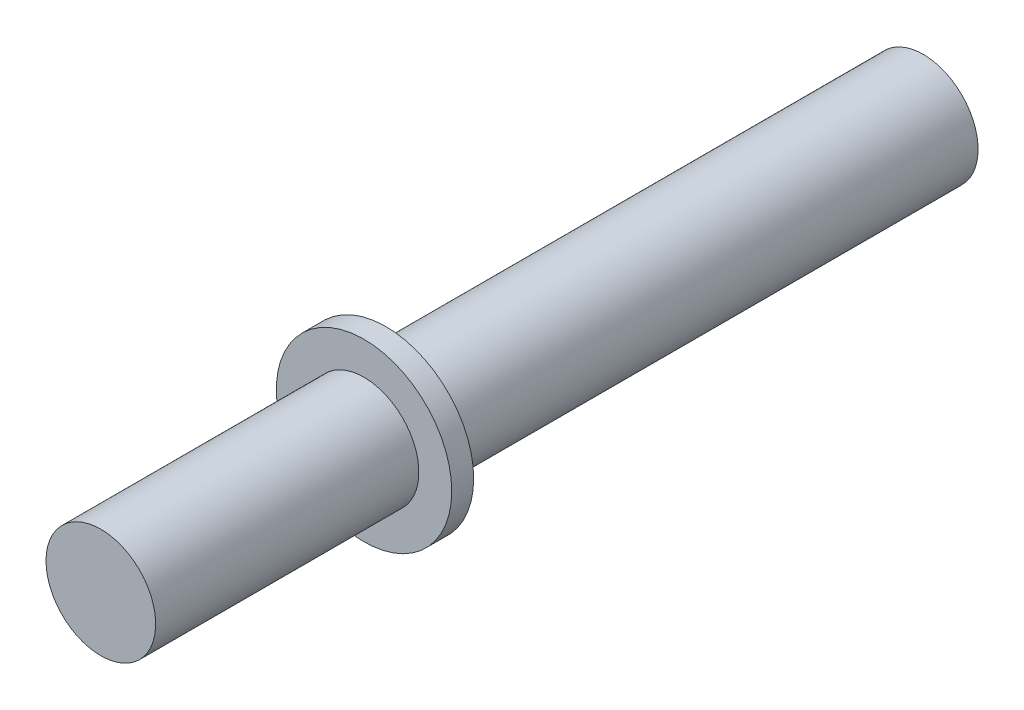
ISO-10303-21;
HEADER;
FILE_DESCRIPTION(('STEP AP214'),'2;1');
FILE_NAME('part.step','',(''),(''),'','','');
FILE_SCHEMA(('AUTOMOTIVE_DESIGN { 1 0 10303 214 1 1 1 1 }'));
ENDSEC;
DATA;
#1=APPLICATION_CONTEXT('core data for automotive mechanical design processes');
#2=APPLICATION_PROTOCOL_DEFINITION('international standard','automotive_design',2000,#1);
#3=PRODUCT_CONTEXT('',#1,'mechanical');
#4=PRODUCT('Part','Part','',(#3));
#5=PRODUCT_RELATED_PRODUCT_CATEGORY('part','',(#4));
#6=PRODUCT_DEFINITION_FORMATION('','',#4);
#7=PRODUCT_DEFINITION_CONTEXT('part definition',#1,'design');
#8=PRODUCT_DEFINITION('design','',#6,#7);
#9=PRODUCT_DEFINITION_SHAPE('','',#8);
#10=(LENGTH_UNIT() NAMED_UNIT(*) SI_UNIT(.MILLI.,.METRE.));
#11=(NAMED_UNIT(*) PLANE_ANGLE_UNIT() SI_UNIT($,.RADIAN.));
#12=(NAMED_UNIT(*) SI_UNIT($,.STERADIAN.) SOLID_ANGLE_UNIT());
#13=UNCERTAINTY_MEASURE_WITH_UNIT(LENGTH_MEASURE(1.E-05),#10,'distance_accuracy_value','');
#14=(GEOMETRIC_REPRESENTATION_CONTEXT(3) GLOBAL_UNCERTAINTY_ASSIGNED_CONTEXT((#13)) GLOBAL_UNIT_ASSIGNED_CONTEXT((#10,
#11,#12)) REPRESENTATION_CONTEXT('',''));
#15=CARTESIAN_POINT('',(0.,0.,0.));
#16=DIRECTION('',(0.,0.,1.));
#17=DIRECTION('',(1.,0.,0.));
#18=AXIS2_PLACEMENT_3D('',#15,#16,#17);
#19=CARTESIAN_POINT('',(-32.018684277368,-41.7454165571395,44.));
#20=DIRECTION('',(0.,0.,-1.));
#21=DIRECTION('',(-1.,0.,0.));
#22=AXIS2_PLACEMENT_3D('',#19,#20,#21);
#23=CYLINDRICAL_SURFACE('',#22,1.5);
#24=CARTESIAN_POINT('',(-32.018684277368,-41.7454165571395,36.8));
#25=DIRECTION('',(0.,0.,1.));
#26=DIRECTION('',(1.,0.,0.));
#27=AXIS2_PLACEMENT_3D('',#24,#25,#26);
#28=CIRCLE('',#27,1.5);
#29=CARTESIAN_POINT('',(-33.518684277368,-41.7454165571395,36.8));
#30=VERTEX_POINT('',#29);
#31=EDGE_CURVE('E41',#30,#30,#28,.T.);
#32=CARTESIAN_POINT('',(-32.018684277368,-41.7454165571395,44.));
#33=DIRECTION('',(0.,0.,1.));
#34=DIRECTION('',(1.,0.,0.));
#35=AXIS2_PLACEMENT_3D('',#32,#33,#34);
#36=CIRCLE('',#35,1.5);
#37=CARTESIAN_POINT('',(-33.518684277368,-41.7454165571395,44.));
#38=VERTEX_POINT('',#37);
#39=EDGE_CURVE('E45',#38,#38,#36,.T.);
#40=CARTESIAN_POINT('',(-33.518684277368,-41.7454165571395,36.8));
#41=CARTESIAN_POINT('',(-33.518684277368,-41.7454165571395,36.875));
#42=CARTESIAN_POINT('',(-33.518684277368,-41.7454165571395,36.95));
#43=CARTESIAN_POINT('',(-33.518684277368,-41.7454165571395,37.1));
#44=CARTESIAN_POINT('',(-33.518684277368,-41.7454165571395,37.175));
#45=CARTESIAN_POINT('',(-33.518684277368,-41.7454165571395,37.325));
#46=CARTESIAN_POINT('',(-33.518684277368,-41.7454165571395,37.4));
#47=CARTESIAN_POINT('',(-33.518684277368,-41.7454165571395,37.55));
#48=CARTESIAN_POINT('',(-33.518684277368,-41.7454165571395,37.625));
#49=CARTESIAN_POINT('',(-33.518684277368,-41.7454165571395,37.775));
#50=CARTESIAN_POINT('',(-33.518684277368,-41.7454165571395,37.85));
#51=CARTESIAN_POINT('',(-33.518684277368,-41.7454165571395,38.));
#52=CARTESIAN_POINT('',(-33.518684277368,-41.7454165571395,38.075));
#53=CARTESIAN_POINT('',(-33.518684277368,-41.7454165571395,38.225));
#54=CARTESIAN_POINT('',(-33.518684277368,-41.7454165571395,38.3));
#55=CARTESIAN_POINT('',(-33.518684277368,-41.7454165571395,38.45));
#56=CARTESIAN_POINT('',(-33.518684277368,-41.7454165571395,38.525));
#57=CARTESIAN_POINT('',(-33.518684277368,-41.7454165571395,38.675));
#58=CARTESIAN_POINT('',(-33.518684277368,-41.7454165571395,38.75));
#59=CARTESIAN_POINT('',(-33.518684277368,-41.7454165571395,38.9));
#60=CARTESIAN_POINT('',(-33.518684277368,-41.7454165571395,38.975));
#61=CARTESIAN_POINT('',(-33.518684277368,-41.7454165571395,39.125));
#62=CARTESIAN_POINT('',(-33.518684277368,-41.7454165571395,39.2));
#63=CARTESIAN_POINT('',(-33.518684277368,-41.7454165571395,39.35));
#64=CARTESIAN_POINT('',(-33.518684277368,-41.7454165571395,39.425));
#65=CARTESIAN_POINT('',(-33.518684277368,-41.7454165571395,39.575));
#66=CARTESIAN_POINT('',(-33.518684277368,-41.7454165571395,39.65));
#67=CARTESIAN_POINT('',(-33.518684277368,-41.7454165571395,39.8));
#68=CARTESIAN_POINT('',(-33.518684277368,-41.7454165571395,39.875));
#69=CARTESIAN_POINT('',(-33.518684277368,-41.7454165571395,40.025));
#70=CARTESIAN_POINT('',(-33.518684277368,-41.7454165571395,40.1));
#71=CARTESIAN_POINT('',(-33.518684277368,-41.7454165571395,40.25));
#72=CARTESIAN_POINT('',(-33.518684277368,-41.7454165571395,40.325));
#73=CARTESIAN_POINT('',(-33.518684277368,-41.7454165571395,40.475));
#74=CARTESIAN_POINT('',(-33.518684277368,-41.7454165571395,40.55));
#75=CARTESIAN_POINT('',(-33.518684277368,-41.7454165571395,40.7));
#76=CARTESIAN_POINT('',(-33.518684277368,-41.7454165571395,40.775));
#77=CARTESIAN_POINT('',(-33.518684277368,-41.7454165571395,40.925));
#78=CARTESIAN_POINT('',(-33.518684277368,-41.7454165571395,41.));
#79=CARTESIAN_POINT('',(-33.518684277368,-41.7454165571395,41.15));
#80=CARTESIAN_POINT('',(-33.518684277368,-41.7454165571395,41.225));
#81=CARTESIAN_POINT('',(-33.518684277368,-41.7454165571395,41.375));
#82=CARTESIAN_POINT('',(-33.518684277368,-41.7454165571395,41.45));
#83=CARTESIAN_POINT('',(-33.518684277368,-41.7454165571395,41.6));
#84=CARTESIAN_POINT('',(-33.518684277368,-41.7454165571395,41.675));
#85=CARTESIAN_POINT('',(-33.518684277368,-41.7454165571395,41.825));
#86=CARTESIAN_POINT('',(-33.518684277368,-41.7454165571395,41.9));
#87=CARTESIAN_POINT('',(-33.518684277368,-41.7454165571395,42.05));
#88=CARTESIAN_POINT('',(-33.518684277368,-41.7454165571395,42.125));
#89=CARTESIAN_POINT('',(-33.518684277368,-41.7454165571395,42.275));
#90=CARTESIAN_POINT('',(-33.518684277368,-41.7454165571395,42.35));
#91=CARTESIAN_POINT('',(-33.518684277368,-41.7454165571395,42.5));
#92=CARTESIAN_POINT('',(-33.518684277368,-41.7454165571395,42.575));
#93=CARTESIAN_POINT('',(-33.518684277368,-41.7454165571395,42.725));
#94=CARTESIAN_POINT('',(-33.518684277368,-41.7454165571395,42.8));
#95=CARTESIAN_POINT('',(-33.518684277368,-41.7454165571395,42.95));
#96=CARTESIAN_POINT('',(-33.518684277368,-41.7454165571395,43.025));
#97=CARTESIAN_POINT('',(-33.518684277368,-41.7454165571395,43.175));
#98=CARTESIAN_POINT('',(-33.518684277368,-41.7454165571395,43.25));
#99=CARTESIAN_POINT('',(-33.518684277368,-41.7454165571395,43.4));
#100=CARTESIAN_POINT('',(-33.518684277368,-41.7454165571395,43.475));
#101=CARTESIAN_POINT('',(-33.518684277368,-41.7454165571395,43.625));
#102=CARTESIAN_POINT('',(-33.518684277368,-41.7454165571395,43.7));
#103=CARTESIAN_POINT('',(-33.518684277368,-41.7454165571395,43.85));
#104=CARTESIAN_POINT('',(-33.518684277368,-41.7454165571395,43.925));
#105=CARTESIAN_POINT('',(-33.518684277368,-41.7454165571395,44.));
#106=B_SPLINE_CURVE_WITH_KNOTS('',3,(#40,#41,#42,#43,#44,#45,#46,#47,#48,#49,#50,#51,#52,#53,
#54,#55,#56,#57,#58,#59,#60,#61,#62,#63,#64,#65,#66,#67,#68,#69,#70,#71,#72,#73,#74,#75,#76,#77,
#78,#79,#80,#81,#82,#83,#84,#85,#86,#87,#88,#89,#90,#91,#92,#93,#94,#95,#96,#97,#98,#99,#100,
#101,#102,#103,#104,#105),.UNSPECIFIED.,.F.,.F.,(4,2,2,2,2,2,2,2,2,2,2,2,2,2,2,2,2,2,2,2,2,2,2,
2,2,2,2,2,2,2,2,2,4),(0.,0.224999999999996,0.449999999999999,0.674999999999995,
0.899999999999998,1.12499999999999,1.35,1.57499999999999,1.8,2.02499999999999,2.25,2.475,
2.69999999999999,2.92499999999999,3.14999999999999,3.375,3.59999999999999,3.82499999999999,
4.04999999999999,4.27499999999999,4.49999999999999,4.72499999999999,4.94999999999999,
5.17499999999999,5.39999999999999,5.62499999999999,5.84999999999999,6.07499999999999,
6.29999999999999,6.52499999999999,6.74999999999999,6.97499999999999,7.19999999999999),.UNSPECIFIED.);
#107=EDGE_CURVE('BSEAM38',#30,#38,#106,.T.);
#108=ORIENTED_EDGE('',*,*,#31,.T.);
#109=ORIENTED_EDGE('',*,*,#39,.F.);
#110=ORIENTED_EDGE('',*,*,#107,.T.);
#111=ORIENTED_EDGE('',*,*,#107,.F.);
#112=EDGE_LOOP('',(#108,#110,#109,#111));
#113=FACE_BOUND('',#112,.T.);
#114=ADVANCED_FACE('F38',(#113),#23,.T.);
#115=CARTESIAN_POINT('',(-32.018684277368,-41.7454165571395,44.));
#116=DIRECTION('',(0.,0.,1.));
#117=DIRECTION('',(1.,0.,0.));
#118=AXIS2_PLACEMENT_3D('',#115,#116,#117);
#119=PLANE('',#118);
#120=ORIENTED_EDGE('',*,*,#39,.T.);
#121=EDGE_LOOP('',(#120));
#122=FACE_BOUND('',#121,.T.);
#123=ADVANCED_FACE('F77',(#122),#119,.T.);
#124=CARTESIAN_POINT('',(-32.018684277368,-41.7454165571395,36.8));
#125=DIRECTION('',(0.,0.,-1.));
#126=DIRECTION('',(-1.,0.,0.));
#127=AXIS2_PLACEMENT_3D('',#124,#125,#126);
#128=CYLINDRICAL_SURFACE('',#127,2.4);
#129=CARTESIAN_POINT('',(-32.018684277368,-41.7454165571395,36.8));
#130=DIRECTION('',(0.,0.,1.));
#131=DIRECTION('',(1.,0.,0.));
#132=AXIS2_PLACEMENT_3D('',#129,#130,#131);
#133=CIRCLE('',#132,2.4);
#134=CARTESIAN_POINT('',(-29.618684277368,-41.7454165571395,36.8));
#135=VERTEX_POINT('',#134);
#136=EDGE_CURVE('E57',#135,#135,#133,.T.);
#137=ORIENTED_EDGE('',*,*,#136,.F.);
#138=EDGE_LOOP('',(#137));
#139=FACE_BOUND('',#138,.T.);
#140=CARTESIAN_POINT('',(-32.018684277368,-41.7454165571395,36.2));
#141=DIRECTION('',(0.,0.,1.));
#142=DIRECTION('',(1.,0.,0.));
#143=AXIS2_PLACEMENT_3D('',#140,#141,#142);
#144=CIRCLE('',#143,2.4);
#145=CARTESIAN_POINT('',(-29.618684277368,-41.7454165571395,36.2));
#146=VERTEX_POINT('',#145);
#147=EDGE_CURVE('E54',#146,#146,#144,.T.);
#148=ORIENTED_EDGE('',*,*,#147,.T.);
#149=EDGE_LOOP('',(#148));
#150=FACE_BOUND('',#149,.T.);
#151=ADVANCED_FACE('F69',(#139,#150),#128,.T.);
#152=CARTESIAN_POINT('',(-32.018684277368,-41.7454165571395,36.8));
#153=DIRECTION('',(0.,0.,1.));
#154=DIRECTION('',(1.,0.,0.));
#155=AXIS2_PLACEMENT_3D('',#152,#153,#154);
#156=PLANE('',#155);
#157=ORIENTED_EDGE('',*,*,#31,.F.);
#158=EDGE_LOOP('',(#157));
#159=FACE_BOUND('',#158,.T.);
#160=ORIENTED_EDGE('',*,*,#136,.T.);
#161=EDGE_LOOP('',(#160));
#162=FACE_BOUND('',#161,.T.);
#163=ADVANCED_FACE('F66',(#159,#162),#156,.T.);
#164=CARTESIAN_POINT('',(-32.018684277368,-41.7454165571395,36.2));
#165=DIRECTION('',(0.,0.,1.));
#166=DIRECTION('',(1.,0.,0.));
#167=AXIS2_PLACEMENT_3D('',#164,#165,#166);
#168=PLANE('',#167);
#169=CARTESIAN_POINT('',(-32.018684277368,-41.7454165571395,36.2));
#170=DIRECTION('',(0.,0.,1.));
#171=DIRECTION('',(1.,0.,0.));
#172=AXIS2_PLACEMENT_3D('',#169,#170,#171);
#173=CIRCLE('',#172,1.5);
#174=CARTESIAN_POINT('',(-33.518684277368,-41.7454165571395,36.2));
#175=VERTEX_POINT('',#174);
#176=EDGE_CURVE('E10',#175,#175,#173,.T.);
#177=ORIENTED_EDGE('',*,*,#176,.T.);
#178=EDGE_LOOP('',(#177));
#179=FACE_BOUND('',#178,.T.);
#180=ORIENTED_EDGE('',*,*,#147,.F.);
#181=EDGE_LOOP('',(#180));
#182=FACE_BOUND('',#181,.T.);
#183=ADVANCED_FACE('F68',(#179,#182),#168,.F.);
#184=CARTESIAN_POINT('',(-32.018684277368,-41.7454165571395,21.5));
#185=DIRECTION('',(0.,0.,1.));
#186=DIRECTION('',(1.,0.,0.));
#187=AXIS2_PLACEMENT_3D('',#184,#185,#186);
#188=PLANE('',#187);
#189=CARTESIAN_POINT('',(-32.018684277368,-41.7454165571395,21.5));
#190=DIRECTION('',(0.,0.,1.));
#191=DIRECTION('',(1.,0.,0.));
#192=AXIS2_PLACEMENT_3D('',#189,#190,#191);
#193=CIRCLE('',#192,1.5);
#194=CARTESIAN_POINT('',(-33.518684277368,-41.7454165571395,21.5));
#195=VERTEX_POINT('',#194);
#196=EDGE_CURVE('E49',#195,#195,#193,.T.);
#197=ORIENTED_EDGE('',*,*,#196,.F.);
#198=EDGE_LOOP('',(#197));
#199=FACE_BOUND('',#198,.T.);
#200=ADVANCED_FACE('F75',(#199),#188,.F.);
#201=CARTESIAN_POINT('',(-33.518684277368,-41.7454165571395,21.5));
#202=CARTESIAN_POINT('',(-33.518684277368,-41.7454165571395,21.653125));
#203=CARTESIAN_POINT('',(-33.518684277368,-41.7454165571395,21.80625));
#204=CARTESIAN_POINT('',(-33.518684277368,-41.7454165571395,22.1125));
#205=CARTESIAN_POINT('',(-33.518684277368,-41.7454165571395,22.265625));
#206=CARTESIAN_POINT('',(-33.518684277368,-41.7454165571395,22.571875));
#207=CARTESIAN_POINT('',(-33.518684277368,-41.7454165571395,22.725));
#208=CARTESIAN_POINT('',(-33.518684277368,-41.7454165571395,23.03125));
#209=CARTESIAN_POINT('',(-33.518684277368,-41.7454165571395,23.184375));
#210=CARTESIAN_POINT('',(-33.518684277368,-41.7454165571395,23.490625));
#211=CARTESIAN_POINT('',(-33.518684277368,-41.7454165571395,23.64375));
#212=CARTESIAN_POINT('',(-33.518684277368,-41.7454165571395,23.95));
#213=CARTESIAN_POINT('',(-33.518684277368,-41.7454165571395,24.103125));
#214=CARTESIAN_POINT('',(-33.518684277368,-41.7454165571395,24.409375));
#215=CARTESIAN_POINT('',(-33.518684277368,-41.7454165571395,24.5625));
#216=CARTESIAN_POINT('',(-33.518684277368,-41.7454165571395,24.86875));
#217=CARTESIAN_POINT('',(-33.518684277368,-41.7454165571395,25.021875));
#218=CARTESIAN_POINT('',(-33.518684277368,-41.7454165571395,25.328125));
#219=CARTESIAN_POINT('',(-33.518684277368,-41.7454165571395,25.48125));
#220=CARTESIAN_POINT('',(-33.518684277368,-41.7454165571395,25.7875));
#221=CARTESIAN_POINT('',(-33.518684277368,-41.7454165571395,25.940625));
#222=CARTESIAN_POINT('',(-33.518684277368,-41.7454165571395,26.246875));
#223=CARTESIAN_POINT('',(-33.518684277368,-41.7454165571395,26.4));
#224=CARTESIAN_POINT('',(-33.518684277368,-41.7454165571395,26.70625));
#225=CARTESIAN_POINT('',(-33.518684277368,-41.7454165571395,26.859375));
#226=CARTESIAN_POINT('',(-33.518684277368,-41.7454165571395,27.165625));
#227=CARTESIAN_POINT('',(-33.518684277368,-41.7454165571395,27.31875));
#228=CARTESIAN_POINT('',(-33.518684277368,-41.7454165571395,27.625));
#229=CARTESIAN_POINT('',(-33.518684277368,-41.7454165571395,27.778125));
#230=CARTESIAN_POINT('',(-33.518684277368,-41.7454165571395,28.084375));
#231=CARTESIAN_POINT('',(-33.518684277368,-41.7454165571395,28.2375));
#232=CARTESIAN_POINT('',(-33.518684277368,-41.7454165571395,28.54375));
#233=CARTESIAN_POINT('',(-33.518684277368,-41.7454165571395,28.696875));
#234=CARTESIAN_POINT('',(-33.518684277368,-41.7454165571395,29.003125));
#235=CARTESIAN_POINT('',(-33.518684277368,-41.7454165571395,29.15625));
#236=CARTESIAN_POINT('',(-33.518684277368,-41.7454165571395,29.4625));
#237=CARTESIAN_POINT('',(-33.518684277368,-41.7454165571395,29.615625));
#238=CARTESIAN_POINT('',(-33.518684277368,-41.7454165571395,29.921875));
#239=CARTESIAN_POINT('',(-33.518684277368,-41.7454165571395,30.075));
#240=CARTESIAN_POINT('',(-33.518684277368,-41.7454165571395,30.38125));
#241=CARTESIAN_POINT('',(-33.518684277368,-41.7454165571395,30.534375));
#242=CARTESIAN_POINT('',(-33.518684277368,-41.7454165571395,30.840625));
#243=CARTESIAN_POINT('',(-33.518684277368,-41.7454165571395,30.99375));
#244=CARTESIAN_POINT('',(-33.518684277368,-41.7454165571395,31.3));
#245=CARTESIAN_POINT('',(-33.518684277368,-41.7454165571395,31.453125));
#246=CARTESIAN_POINT('',(-33.518684277368,-41.7454165571395,31.759375));
#247=CARTESIAN_POINT('',(-33.518684277368,-41.7454165571395,31.9125));
#248=CARTESIAN_POINT('',(-33.518684277368,-41.7454165571395,32.21875));
#249=CARTESIAN_POINT('',(-33.518684277368,-41.7454165571395,32.371875));
#250=CARTESIAN_POINT('',(-33.518684277368,-41.7454165571395,32.678125));
#251=CARTESIAN_POINT('',(-33.518684277368,-41.7454165571395,32.83125));
#252=CARTESIAN_POINT('',(-33.518684277368,-41.7454165571395,33.1375));
#253=CARTESIAN_POINT('',(-33.518684277368,-41.7454165571395,33.290625));
#254=CARTESIAN_POINT('',(-33.518684277368,-41.7454165571395,33.596875));
#255=CARTESIAN_POINT('',(-33.518684277368,-41.7454165571395,33.75));
#256=CARTESIAN_POINT('',(-33.518684277368,-41.7454165571395,34.05625));
#257=CARTESIAN_POINT('',(-33.518684277368,-41.7454165571395,34.209375));
#258=CARTESIAN_POINT('',(-33.518684277368,-41.7454165571395,34.515625));
#259=CARTESIAN_POINT('',(-33.518684277368,-41.7454165571395,34.66875));
#260=CARTESIAN_POINT('',(-33.518684277368,-41.7454165571395,34.975));
#261=CARTESIAN_POINT('',(-33.518684277368,-41.7454165571395,35.128125));
#262=CARTESIAN_POINT('',(-33.518684277368,-41.7454165571395,35.434375));
#263=CARTESIAN_POINT('',(-33.518684277368,-41.7454165571395,35.5875));
#264=CARTESIAN_POINT('',(-33.518684277368,-41.7454165571395,35.89375));
#265=CARTESIAN_POINT('',(-33.518684277368,-41.7454165571395,36.046875));
#266=CARTESIAN_POINT('',(-33.518684277368,-41.7454165571395,36.2));
#267=B_SPLINE_CURVE_WITH_KNOTS('',3,(#201,#202,#203,#204,#205,#206,#207,#208,#209,#210,#211,
#212,#213,#214,#215,#216,#217,#218,#219,#220,#221,#222,#223,#224,#225,#226,#227,#228,#229,#230,
#231,#232,#233,#234,#235,#236,#237,#238,#239,#240,#241,#242,#243,#244,#245,#246,#247,#248,#249,
#250,#251,#252,#253,#254,#255,#256,#257,#258,#259,#260,#261,#262,#263,#264,#265,#266),
.UNSPECIFIED.,.F.,.F.,(4,2,2,2,2,2,2,2,2,2,2,2,2,2,2,2,2,2,2,2,2,2,2,2,2,2,2,2,2,2,2,2,4),(0.,
0.459375000000001,0.918749999999999,1.378125,1.8375,2.296875,2.75625,3.215625,3.675,4.134375,
4.59375,5.053125,5.5125,5.971875,6.43125,6.890625,7.35,7.809375,8.26875,8.728125,
9.18750000000001,9.646875,10.10625,10.565625,11.025,11.484375,11.94375,12.403125,12.8625,
13.321875,13.78125,14.240625,14.7),.UNSPECIFIED.);
#268=EDGE_CURVE('BSEAM81',#195,#175,#267,.T.);
#269=ORIENTED_EDGE('',*,*,#196,.T.);
#270=ORIENTED_EDGE('',*,*,#176,.F.);
#271=ORIENTED_EDGE('',*,*,#268,.T.);
#272=ORIENTED_EDGE('',*,*,#268,.F.);
#273=EDGE_LOOP('',(#269,#271,#270,#272));
#274=FACE_BOUND('',#273,.T.);
#275=ADVANCED_FACE('F81',(#274),#23,.T.);
#276=CLOSED_SHELL('',(#114,#123,#151,#163,#183,#200,#275));
#277=MANIFOLD_SOLID_BREP('B2',#276);
#278=ADVANCED_BREP_SHAPE_REPRESENTATION('',(#18,#277),#14);
#279=SHAPE_DEFINITION_REPRESENTATION(#9,#278);
ENDSEC;
END-ISO-10303-21;
